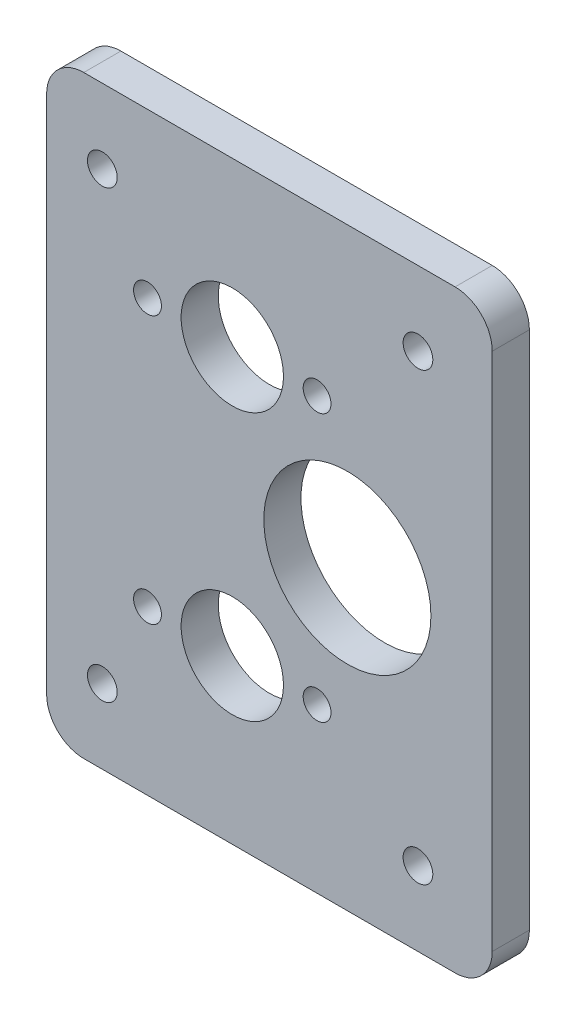
ISO-10303-21;
HEADER;
FILE_DESCRIPTION(('STEP AP214'),'2;1');
FILE_NAME('part.step','',(''),(''),'','','');
FILE_SCHEMA(('AUTOMOTIVE_DESIGN { 1 0 10303 214 1 1 1 1 }'));
ENDSEC;
DATA;
#1=APPLICATION_CONTEXT('core data for automotive mechanical design processes');
#2=APPLICATION_PROTOCOL_DEFINITION('international standard','automotive_design',2000,#1);
#3=PRODUCT_CONTEXT('',#1,'mechanical');
#4=PRODUCT('Part','Part','',(#3));
#5=PRODUCT_RELATED_PRODUCT_CATEGORY('part','',(#4));
#6=PRODUCT_DEFINITION_FORMATION('','',#4);
#7=PRODUCT_DEFINITION_CONTEXT('part definition',#1,'design');
#8=PRODUCT_DEFINITION('design','',#6,#7);
#9=PRODUCT_DEFINITION_SHAPE('','',#8);
#10=(LENGTH_UNIT() NAMED_UNIT(*) SI_UNIT(.MILLI.,.METRE.));
#11=(NAMED_UNIT(*) PLANE_ANGLE_UNIT() SI_UNIT($,.RADIAN.));
#12=(NAMED_UNIT(*) SI_UNIT($,.STERADIAN.) SOLID_ANGLE_UNIT());
#13=UNCERTAINTY_MEASURE_WITH_UNIT(LENGTH_MEASURE(1.E-05),#10,'distance_accuracy_value','');
#14=(GEOMETRIC_REPRESENTATION_CONTEXT(3) GLOBAL_UNCERTAINTY_ASSIGNED_CONTEXT((#13)) GLOBAL_UNIT_ASSIGNED_CONTEXT((#10,
#11,#12)) REPRESENTATION_CONTEXT('',''));
#15=CARTESIAN_POINT('',(0.,0.,0.));
#16=DIRECTION('',(0.,0.,1.));
#17=DIRECTION('',(1.,0.,0.));
#18=AXIS2_PLACEMENT_3D('',#15,#16,#17);
#19=CARTESIAN_POINT('',(0.,27.94,6.35));
#20=DIRECTION('',(0.,1.,0.));
#21=DIRECTION('',(0.,0.,1.));
#22=AXIS2_PLACEMENT_3D('',#19,#20,#21);
#23=PLANE('',#22);
#24=DIRECTION('',(1.,0.,0.));
#25=VECTOR('',#24,1.);
#26=CARTESIAN_POINT('',(0.,27.94,0.));
#27=LINE('',#26,#25);
#28=CARTESIAN_POINT('',(-25.4,27.94,0.));
#29=VERTEX_POINT('',#28);
#30=CARTESIAN_POINT('',(38.1,27.94,0.));
#31=VERTEX_POINT('',#30);
#32=EDGE_CURVE('E152',#29,#31,#27,.T.);
#33=ORIENTED_EDGE('',*,*,#32,.F.);
#34=DIRECTION('',(0.,0.,-1.));
#35=VECTOR('',#34,1.);
#36=CARTESIAN_POINT('',(-25.4,27.94,6.35));
#37=LINE('',#36,#35);
#38=CARTESIAN_POINT('',(-25.4,27.94,6.35));
#39=VERTEX_POINT('',#38);
#40=EDGE_CURVE('E11',#39,#29,#37,.T.);
#41=ORIENTED_EDGE('',*,*,#40,.F.);
#42=DIRECTION('',(1.,0.,0.));
#43=VECTOR('',#42,1.);
#44=CARTESIAN_POINT('',(0.,27.94,6.35));
#45=LINE('',#44,#43);
#46=CARTESIAN_POINT('',(38.1,27.94,6.35));
#47=VERTEX_POINT('',#46);
#48=EDGE_CURVE('E433',#39,#47,#45,.T.);
#49=ORIENTED_EDGE('',*,*,#48,.T.);
#50=DIRECTION('',(0.,0.,-1.));
#51=VECTOR('',#50,1.);
#52=CARTESIAN_POINT('',(38.1,27.94,6.35));
#53=LINE('',#52,#51);
#54=EDGE_CURVE('E53',#47,#31,#53,.T.);
#55=ORIENTED_EDGE('',*,*,#54,.T.);
#56=EDGE_LOOP('',(#33,#41,#49,#55));
#57=FACE_BOUND('',#56,.T.);
#58=ADVANCED_FACE('F36',(#57),#23,.T.);
#59=CARTESIAN_POINT('',(-25.4,21.59,6.35));
#60=DIRECTION('',(0.,0.,-1.));
#61=DIRECTION('',(-1.,0.,0.));
#62=AXIS2_PLACEMENT_3D('',#59,#60,#61);
#63=CYLINDRICAL_SURFACE('',#62,6.35);
#64=CARTESIAN_POINT('',(-25.4,21.59,0.));
#65=DIRECTION('',(0.,0.,1.));
#66=DIRECTION('',(1.,0.,0.));
#67=AXIS2_PLACEMENT_3D('',#64,#65,#66);
#68=CIRCLE('',#67,6.35);
#69=CARTESIAN_POINT('',(-31.75,21.59,0.));
#70=VERTEX_POINT('',#69);
#71=EDGE_CURVE('E154',#29,#70,#68,.T.);
#72=ORIENTED_EDGE('',*,*,#71,.T.);
#73=DIRECTION('',(0.,0.,-1.));
#74=VECTOR('',#73,1.);
#75=CARTESIAN_POINT('',(-31.75,21.59,6.35));
#76=LINE('',#75,#74);
#77=CARTESIAN_POINT('',(-31.75,21.59,6.35));
#78=VERTEX_POINT('',#77);
#79=EDGE_CURVE('E45',#78,#70,#76,.T.);
#80=ORIENTED_EDGE('',*,*,#79,.F.);
#81=CARTESIAN_POINT('',(-25.4,21.59,6.35));
#82=DIRECTION('',(0.,0.,1.));
#83=DIRECTION('',(1.,0.,0.));
#84=AXIS2_PLACEMENT_3D('',#81,#82,#83);
#85=CIRCLE('',#84,6.35);
#86=EDGE_CURVE('E435',#39,#78,#85,.T.);
#87=ORIENTED_EDGE('',*,*,#86,.F.);
#88=ORIENTED_EDGE('',*,*,#40,.T.);
#89=EDGE_LOOP('',(#72,#80,#87,#88));
#90=FACE_BOUND('',#89,.T.);
#91=ADVANCED_FACE('F191',(#90),#63,.T.);
#92=CARTESIAN_POINT('',(-31.75,0.,6.35));
#93=DIRECTION('',(1.,0.,0.));
#94=DIRECTION('',(0.,1.,0.));
#95=AXIS2_PLACEMENT_3D('',#92,#93,#94);
#96=PLANE('',#95);
#97=DIRECTION('',(0.,-1.,0.));
#98=VECTOR('',#97,1.);
#99=CARTESIAN_POINT('',(-31.75,0.,0.));
#100=LINE('',#99,#98);
#101=CARTESIAN_POINT('',(-31.75,-67.31,0.));
#102=VERTEX_POINT('',#101);
#103=EDGE_CURVE('E157',#70,#102,#100,.T.);
#104=ORIENTED_EDGE('',*,*,#103,.T.);
#105=DIRECTION('',(0.,0.,-1.));
#106=VECTOR('',#105,1.);
#107=CARTESIAN_POINT('',(-31.75,-67.31,6.35));
#108=LINE('',#107,#106);
#109=CARTESIAN_POINT('',(-31.75,-67.31,6.35));
#110=VERTEX_POINT('',#109);
#111=EDGE_CURVE('E179',#110,#102,#108,.T.);
#112=ORIENTED_EDGE('',*,*,#111,.F.);
#113=DIRECTION('',(0.,-1.,0.));
#114=VECTOR('',#113,1.);
#115=CARTESIAN_POINT('',(-31.75,0.,6.35));
#116=LINE('',#115,#114);
#117=EDGE_CURVE('E187',#78,#110,#116,.T.);
#118=ORIENTED_EDGE('',*,*,#117,.F.);
#119=ORIENTED_EDGE('',*,*,#79,.T.);
#120=EDGE_LOOP('',(#104,#112,#118,#119));
#121=FACE_BOUND('',#120,.T.);
#122=ADVANCED_FACE('F184',(#121),#96,.F.);
#123=CARTESIAN_POINT('',(-25.4,-67.31,6.35));
#124=DIRECTION('',(0.,0.,-1.));
#125=DIRECTION('',(-1.,0.,0.));
#126=AXIS2_PLACEMENT_3D('',#123,#124,#125);
#127=CYLINDRICAL_SURFACE('',#126,6.34999999999999);
#128=CARTESIAN_POINT('',(-25.4,-67.31,0.));
#129=DIRECTION('',(0.,0.,1.));
#130=DIRECTION('',(1.,0.,0.));
#131=AXIS2_PLACEMENT_3D('',#128,#129,#130);
#132=CIRCLE('',#131,6.34999999999999);
#133=CARTESIAN_POINT('',(-25.4,-73.66,0.));
#134=VERTEX_POINT('',#133);
#135=EDGE_CURVE('E160',#102,#134,#132,.T.);
#136=ORIENTED_EDGE('',*,*,#135,.T.);
#137=DIRECTION('',(0.,0.,-1.));
#138=VECTOR('',#137,1.);
#139=CARTESIAN_POINT('',(-25.4,-73.66,6.35));
#140=LINE('',#139,#138);
#141=CARTESIAN_POINT('',(-25.4,-73.66,6.35));
#142=VERTEX_POINT('',#141);
#143=EDGE_CURVE('E176',#142,#134,#140,.T.);
#144=ORIENTED_EDGE('',*,*,#143,.F.);
#145=CARTESIAN_POINT('',(-25.4,-67.31,6.35));
#146=DIRECTION('',(0.,0.,1.));
#147=DIRECTION('',(1.,0.,0.));
#148=AXIS2_PLACEMENT_3D('',#145,#146,#147);
#149=CIRCLE('',#148,6.34999999999999);
#150=EDGE_CURVE('E438',#110,#142,#149,.T.);
#151=ORIENTED_EDGE('',*,*,#150,.F.);
#152=ORIENTED_EDGE('',*,*,#111,.T.);
#153=EDGE_LOOP('',(#136,#144,#151,#152));
#154=FACE_BOUND('',#153,.T.);
#155=ADVANCED_FACE('F275',(#154),#127,.T.);
#156=CARTESIAN_POINT('',(0.,-73.66,6.35));
#157=DIRECTION('',(0.,1.,0.));
#158=DIRECTION('',(0.,0.,1.));
#159=AXIS2_PLACEMENT_3D('',#156,#157,#158);
#160=PLANE('',#159);
#161=DIRECTION('',(1.,0.,0.));
#162=VECTOR('',#161,1.);
#163=CARTESIAN_POINT('',(0.,-73.66,0.));
#164=LINE('',#163,#162);
#165=CARTESIAN_POINT('',(38.1,-73.66,0.));
#166=VERTEX_POINT('',#165);
#167=EDGE_CURVE('E163',#134,#166,#164,.T.);
#168=ORIENTED_EDGE('',*,*,#167,.T.);
#169=DIRECTION('',(0.,0.,-1.));
#170=VECTOR('',#169,1.);
#171=CARTESIAN_POINT('',(38.1,-73.66,6.35));
#172=LINE('',#171,#170);
#173=CARTESIAN_POINT('',(38.1,-73.66,6.35));
#174=VERTEX_POINT('',#173);
#175=EDGE_CURVE('E122',#174,#166,#172,.T.);
#176=ORIENTED_EDGE('',*,*,#175,.F.);
#177=DIRECTION('',(1.,0.,0.));
#178=VECTOR('',#177,1.);
#179=CARTESIAN_POINT('',(0.,-73.66,6.35));
#180=LINE('',#179,#178);
#181=EDGE_CURVE('E111',#142,#174,#180,.T.);
#182=ORIENTED_EDGE('',*,*,#181,.F.);
#183=ORIENTED_EDGE('',*,*,#143,.T.);
#184=EDGE_LOOP('',(#168,#176,#182,#183));
#185=FACE_BOUND('',#184,.T.);
#186=ADVANCED_FACE('F272',(#185),#160,.F.);
#187=CARTESIAN_POINT('',(38.1,-67.31,6.35));
#188=DIRECTION('',(0.,0.,-1.));
#189=DIRECTION('',(-1.,0.,0.));
#190=AXIS2_PLACEMENT_3D('',#187,#188,#189);
#191=CYLINDRICAL_SURFACE('',#190,6.35);
#192=CARTESIAN_POINT('',(38.1,-67.31,0.));
#193=DIRECTION('',(0.,0.,1.));
#194=DIRECTION('',(1.,0.,0.));
#195=AXIS2_PLACEMENT_3D('',#192,#193,#194);
#196=CIRCLE('',#195,6.35);
#197=CARTESIAN_POINT('',(44.45,-67.31,0.));
#198=VERTEX_POINT('',#197);
#199=EDGE_CURVE('E119',#166,#198,#196,.T.);
#200=ORIENTED_EDGE('',*,*,#199,.T.);
#201=DIRECTION('',(0.,0.,-1.));
#202=VECTOR('',#201,1.);
#203=CARTESIAN_POINT('',(44.45,-67.31,6.35));
#204=LINE('',#203,#202);
#205=CARTESIAN_POINT('',(44.45,-67.31,6.35));
#206=VERTEX_POINT('',#205);
#207=EDGE_CURVE('E117',#206,#198,#204,.T.);
#208=ORIENTED_EDGE('',*,*,#207,.F.);
#209=CARTESIAN_POINT('',(38.1,-67.31,6.35));
#210=DIRECTION('',(0.,0.,1.));
#211=DIRECTION('',(1.,0.,0.));
#212=AXIS2_PLACEMENT_3D('',#209,#210,#211);
#213=CIRCLE('',#212,6.35);
#214=EDGE_CURVE('E103',#174,#206,#213,.T.);
#215=ORIENTED_EDGE('',*,*,#214,.F.);
#216=ORIENTED_EDGE('',*,*,#175,.T.);
#217=EDGE_LOOP('',(#200,#208,#215,#216));
#218=FACE_BOUND('',#217,.T.);
#219=ADVANCED_FACE('F118',(#218),#191,.T.);
#220=CARTESIAN_POINT('',(44.45,0.,6.35));
#221=DIRECTION('',(1.,0.,0.));
#222=DIRECTION('',(0.,1.,0.));
#223=AXIS2_PLACEMENT_3D('',#220,#221,#222);
#224=PLANE('',#223);
#225=DIRECTION('',(0.,-1.,0.));
#226=VECTOR('',#225,1.);
#227=CARTESIAN_POINT('',(44.45,0.,0.));
#228=LINE('',#227,#226);
#229=CARTESIAN_POINT('',(44.45,21.59,0.));
#230=VERTEX_POINT('',#229);
#231=EDGE_CURVE('E167',#230,#198,#228,.T.);
#232=ORIENTED_EDGE('',*,*,#231,.F.);
#233=DIRECTION('',(0.,0.,-1.));
#234=VECTOR('',#233,1.);
#235=CARTESIAN_POINT('',(44.45,21.59,6.35));
#236=LINE('',#235,#234);
#237=CARTESIAN_POINT('',(44.45,21.59,6.35));
#238=VERTEX_POINT('',#237);
#239=EDGE_CURVE('E78',#238,#230,#236,.T.);
#240=ORIENTED_EDGE('',*,*,#239,.F.);
#241=DIRECTION('',(0.,-1.,0.));
#242=VECTOR('',#241,1.);
#243=CARTESIAN_POINT('',(44.45,0.,6.35));
#244=LINE('',#243,#242);
#245=EDGE_CURVE('E109',#238,#206,#244,.T.);
#246=ORIENTED_EDGE('',*,*,#245,.T.);
#247=ORIENTED_EDGE('',*,*,#207,.T.);
#248=EDGE_LOOP('',(#232,#240,#246,#247));
#249=FACE_BOUND('',#248,.T.);
#250=ADVANCED_FACE('F124',(#249),#224,.T.);
#251=CARTESIAN_POINT('',(14.5,0.,6.35));
#252=DIRECTION('',(0.,0.,-1.));
#253=DIRECTION('',(-1.,0.,0.));
#254=AXIS2_PLACEMENT_3D('',#251,#252,#253);
#255=CYLINDRICAL_SURFACE('',#254,2.38125);
#256=CARTESIAN_POINT('',(14.5,0.,6.35));
#257=DIRECTION('',(0.,0.,1.));
#258=DIRECTION('',(1.,0.,0.));
#259=AXIS2_PLACEMENT_3D('',#256,#257,#258);
#260=CIRCLE('',#259,2.38125);
#261=CARTESIAN_POINT('',(16.88125,0.,6.35));
#262=VERTEX_POINT('',#261);
#263=EDGE_CURVE('E430',#262,#262,#260,.T.);
#264=ORIENTED_EDGE('',*,*,#263,.T.);
#265=EDGE_LOOP('',(#264));
#266=FACE_BOUND('',#265,.T.);
#267=CARTESIAN_POINT('',(14.5,0.,0.));
#268=DIRECTION('',(0.,0.,1.));
#269=DIRECTION('',(1.,0.,0.));
#270=AXIS2_PLACEMENT_3D('',#267,#268,#269);
#271=CIRCLE('',#270,2.38125);
#272=CARTESIAN_POINT('',(16.88125,0.,0.));
#273=VERTEX_POINT('',#272);
#274=EDGE_CURVE('E149',#273,#273,#271,.T.);
#275=ORIENTED_EDGE('',*,*,#274,.F.);
#276=EDGE_LOOP('',(#275));
#277=FACE_BOUND('',#276,.T.);
#278=ADVANCED_FACE('F202',(#266,#277),#255,.F.);
#279=CARTESIAN_POINT('',(-14.5,0.,6.35));
#280=DIRECTION('',(0.,0.,-1.));
#281=DIRECTION('',(-1.,0.,0.));
#282=AXIS2_PLACEMENT_3D('',#279,#280,#281);
#283=CYLINDRICAL_SURFACE('',#282,2.38125);
#284=CARTESIAN_POINT('',(-14.5,0.,6.35));
#285=DIRECTION('',(0.,0.,1.));
#286=DIRECTION('',(1.,0.,0.));
#287=AXIS2_PLACEMENT_3D('',#284,#285,#286);
#288=CIRCLE('',#287,2.38125);
#289=CARTESIAN_POINT('',(-12.11875,0.,6.35));
#290=VERTEX_POINT('',#289);
#291=EDGE_CURVE('E427',#290,#290,#288,.T.);
#292=ORIENTED_EDGE('',*,*,#291,.T.);
#293=EDGE_LOOP('',(#292));
#294=FACE_BOUND('',#293,.T.);
#295=CARTESIAN_POINT('',(-14.5,0.,0.));
#296=DIRECTION('',(0.,0.,1.));
#297=DIRECTION('',(1.,0.,0.));
#298=AXIS2_PLACEMENT_3D('',#295,#296,#297);
#299=CIRCLE('',#298,2.38125);
#300=CARTESIAN_POINT('',(-12.11875,0.,0.));
#301=VERTEX_POINT('',#300);
#302=EDGE_CURVE('E146',#301,#301,#299,.T.);
#303=ORIENTED_EDGE('',*,*,#302,.F.);
#304=EDGE_LOOP('',(#303));
#305=FACE_BOUND('',#304,.T.);
#306=ADVANCED_FACE('F205',(#294,#305),#283,.F.);
#307=CARTESIAN_POINT('',(0.,0.,6.35));
#308=DIRECTION('',(0.,0.,-1.));
#309=DIRECTION('',(-1.,0.,0.));
#310=AXIS2_PLACEMENT_3D('',#307,#308,#309);
#311=CYLINDRICAL_SURFACE('',#310,8.75);
#312=CARTESIAN_POINT('',(0.,0.,6.35));
#313=DIRECTION('',(0.,0.,1.));
#314=DIRECTION('',(1.,0.,0.));
#315=AXIS2_PLACEMENT_3D('',#312,#313,#314);
#316=CIRCLE('',#315,8.75);
#317=CARTESIAN_POINT('',(8.75,0.,6.35));
#318=VERTEX_POINT('',#317);
#319=EDGE_CURVE('E424',#318,#318,#316,.T.);
#320=ORIENTED_EDGE('',*,*,#319,.T.);
#321=EDGE_LOOP('',(#320));
#322=FACE_BOUND('',#321,.T.);
#323=CARTESIAN_POINT('',(0.,0.,0.));
#324=DIRECTION('',(0.,0.,1.));
#325=DIRECTION('',(1.,0.,0.));
#326=AXIS2_PLACEMENT_3D('',#323,#324,#325);
#327=CIRCLE('',#326,8.75);
#328=CARTESIAN_POINT('',(8.75,0.,0.));
#329=VERTEX_POINT('',#328);
#330=EDGE_CURVE('E143',#329,#329,#327,.T.);
#331=ORIENTED_EDGE('',*,*,#330,.F.);
#332=EDGE_LOOP('',(#331));
#333=FACE_BOUND('',#332,.T.);
#334=ADVANCED_FACE('F209',(#322,#333),#311,.F.);
#335=CARTESIAN_POINT('',(-14.5,-45.72,6.35));
#336=DIRECTION('',(0.,0.,-1.));
#337=DIRECTION('',(-1.,0.,0.));
#338=AXIS2_PLACEMENT_3D('',#335,#336,#337);
#339=CYLINDRICAL_SURFACE('',#338,2.38125);
#340=CARTESIAN_POINT('',(-14.5,-45.72,6.35));
#341=DIRECTION('',(0.,0.,1.));
#342=DIRECTION('',(1.,0.,0.));
#343=AXIS2_PLACEMENT_3D('',#340,#341,#342);
#344=CIRCLE('',#343,2.38125);
#345=CARTESIAN_POINT('',(-12.11875,-45.72,6.35));
#346=VERTEX_POINT('',#345);
#347=EDGE_CURVE('E421',#346,#346,#344,.T.);
#348=ORIENTED_EDGE('',*,*,#347,.T.);
#349=EDGE_LOOP('',(#348));
#350=FACE_BOUND('',#349,.T.);
#351=CARTESIAN_POINT('',(-14.5,-45.72,0.));
#352=DIRECTION('',(0.,0.,1.));
#353=DIRECTION('',(1.,0.,0.));
#354=AXIS2_PLACEMENT_3D('',#351,#352,#353);
#355=CIRCLE('',#354,2.38125);
#356=CARTESIAN_POINT('',(-12.11875,-45.72,0.));
#357=VERTEX_POINT('',#356);
#358=EDGE_CURVE('E140',#357,#357,#355,.T.);
#359=ORIENTED_EDGE('',*,*,#358,.F.);
#360=EDGE_LOOP('',(#359));
#361=FACE_BOUND('',#360,.T.);
#362=ADVANCED_FACE('F213',(#350,#361),#339,.F.);
#363=CARTESIAN_POINT('',(14.5,-45.72,6.35));
#364=DIRECTION('',(0.,0.,-1.));
#365=DIRECTION('',(-1.,0.,0.));
#366=AXIS2_PLACEMENT_3D('',#363,#364,#365);
#367=CYLINDRICAL_SURFACE('',#366,2.38125);
#368=CARTESIAN_POINT('',(14.5,-45.72,6.35));
#369=DIRECTION('',(0.,0.,1.));
#370=DIRECTION('',(1.,0.,0.));
#371=AXIS2_PLACEMENT_3D('',#368,#369,#370);
#372=CIRCLE('',#371,2.38125);
#373=CARTESIAN_POINT('',(16.88125,-45.72,6.35));
#374=VERTEX_POINT('',#373);
#375=EDGE_CURVE('E418',#374,#374,#372,.T.);
#376=ORIENTED_EDGE('',*,*,#375,.T.);
#377=EDGE_LOOP('',(#376));
#378=FACE_BOUND('',#377,.T.);
#379=CARTESIAN_POINT('',(14.5,-45.72,0.));
#380=DIRECTION('',(0.,0.,1.));
#381=DIRECTION('',(1.,0.,0.));
#382=AXIS2_PLACEMENT_3D('',#379,#380,#381);
#383=CIRCLE('',#382,2.38125);
#384=CARTESIAN_POINT('',(16.88125,-45.72,0.));
#385=VERTEX_POINT('',#384);
#386=EDGE_CURVE('E137',#385,#385,#383,.T.);
#387=ORIENTED_EDGE('',*,*,#386,.F.);
#388=EDGE_LOOP('',(#387));
#389=FACE_BOUND('',#388,.T.);
#390=ADVANCED_FACE('F217',(#378,#389),#367,.F.);
#391=CARTESIAN_POINT('',(19.6773170490796,-22.86,6.35));
#392=DIRECTION('',(0.,0.,-1.));
#393=DIRECTION('',(-1.,0.,0.));
#394=AXIS2_PLACEMENT_3D('',#391,#392,#393);
#395=CYLINDRICAL_SURFACE('',#394,14.2875);
#396=CARTESIAN_POINT('',(19.6773170490796,-22.86,6.35));
#397=DIRECTION('',(0.,0.,1.));
#398=DIRECTION('',(1.,0.,0.));
#399=AXIS2_PLACEMENT_3D('',#396,#397,#398);
#400=CIRCLE('',#399,14.2875);
#401=CARTESIAN_POINT('',(33.9648170490796,-22.86,6.35));
#402=VERTEX_POINT('',#401);
#403=EDGE_CURVE('E232',#402,#402,#400,.T.);
#404=ORIENTED_EDGE('',*,*,#403,.T.);
#405=EDGE_LOOP('',(#404));
#406=FACE_BOUND('',#405,.T.);
#407=CARTESIAN_POINT('',(19.6773170490796,-22.86,0.));
#408=DIRECTION('',(0.,0.,1.));
#409=DIRECTION('',(1.,0.,0.));
#410=AXIS2_PLACEMENT_3D('',#407,#408,#409);
#411=CIRCLE('',#410,14.2875);
#412=CARTESIAN_POINT('',(33.9648170490796,-22.86,0.));
#413=VERTEX_POINT('',#412);
#414=EDGE_CURVE('E133',#413,#413,#411,.T.);
#415=ORIENTED_EDGE('',*,*,#414,.F.);
#416=EDGE_LOOP('',(#415));
#417=FACE_BOUND('',#416,.T.);
#418=ADVANCED_FACE('F220',(#406,#417),#395,.F.);
#419=CARTESIAN_POINT('',(0.,-45.72,6.35));
#420=DIRECTION('',(0.,0.,-1.));
#421=DIRECTION('',(-1.,0.,0.));
#422=AXIS2_PLACEMENT_3D('',#419,#420,#421);
#423=CYLINDRICAL_SURFACE('',#422,8.75);
#424=CARTESIAN_POINT('',(0.,-45.72,6.35));
#425=DIRECTION('',(0.,0.,1.));
#426=DIRECTION('',(1.,0.,0.));
#427=AXIS2_PLACEMENT_3D('',#424,#425,#426);
#428=CIRCLE('',#427,8.75);
#429=CARTESIAN_POINT('',(8.75,-45.72,6.35));
#430=VERTEX_POINT('',#429);
#431=EDGE_CURVE('E172',#430,#430,#428,.T.);
#432=ORIENTED_EDGE('',*,*,#431,.T.);
#433=EDGE_LOOP('',(#432));
#434=FACE_BOUND('',#433,.T.);
#435=CARTESIAN_POINT('',(0.,-45.72,0.));
#436=DIRECTION('',(0.,0.,1.));
#437=DIRECTION('',(1.,0.,0.));
#438=AXIS2_PLACEMENT_3D('',#435,#436,#437);
#439=CIRCLE('',#438,8.75);
#440=CARTESIAN_POINT('',(8.75,-45.72,0.));
#441=VERTEX_POINT('',#440);
#442=EDGE_CURVE('E130',#441,#441,#439,.T.);
#443=ORIENTED_EDGE('',*,*,#442,.F.);
#444=EDGE_LOOP('',(#443));
#445=FACE_BOUND('',#444,.T.);
#446=ADVANCED_FACE('F38',(#434,#445),#423,.F.);
#447=CARTESIAN_POINT('',(38.1,21.59,6.35));
#448=DIRECTION('',(0.,0.,-1.));
#449=DIRECTION('',(-1.,0.,0.));
#450=AXIS2_PLACEMENT_3D('',#447,#448,#449);
#451=CYLINDRICAL_SURFACE('',#450,6.35);
#452=CARTESIAN_POINT('',(38.1,21.59,0.));
#453=DIRECTION('',(0.,0.,1.));
#454=DIRECTION('',(1.,0.,0.));
#455=AXIS2_PLACEMENT_3D('',#452,#453,#454);
#456=CIRCLE('',#455,6.35);
#457=EDGE_CURVE('E169',#31,#230,#456,.F.);
#458=ORIENTED_EDGE('',*,*,#457,.F.);
#459=ORIENTED_EDGE('',*,*,#54,.F.);
#460=CARTESIAN_POINT('',(38.1,21.59,6.35));
#461=DIRECTION('',(0.,0.,1.));
#462=DIRECTION('',(1.,0.,0.));
#463=AXIS2_PLACEMENT_3D('',#460,#461,#462);
#464=CIRCLE('',#463,6.35);
#465=EDGE_CURVE('E125',#47,#238,#464,.F.);
#466=ORIENTED_EDGE('',*,*,#465,.T.);
#467=ORIENTED_EDGE('',*,*,#239,.T.);
#468=EDGE_LOOP('',(#458,#459,#466,#467));
#469=FACE_BOUND('',#468,.T.);
#470=ADVANCED_FACE('F227',(#469),#451,.T.);
#471=CARTESIAN_POINT('',(0.,0.,6.35));
#472=DIRECTION('',(0.,0.,1.));
#473=DIRECTION('',(1.,0.,0.));
#474=AXIS2_PLACEMENT_3D('',#471,#472,#473);
#475=PLANE('',#474);
#476=CARTESIAN_POINT('',(31.75,15.24,6.35));
#477=DIRECTION('',(0.,0.,1.));
#478=DIRECTION('',(1.,0.,0.));
#479=AXIS2_PLACEMENT_3D('',#476,#477,#478);
#480=CIRCLE('',#479,2.54);
#481=CARTESIAN_POINT('',(34.29,15.24,6.35));
#482=VERTEX_POINT('',#481);
#483=EDGE_CURVE('E394',#482,#482,#480,.T.);
#484=ORIENTED_EDGE('',*,*,#483,.F.);
#485=EDGE_LOOP('',(#484));
#486=FACE_BOUND('',#485,.T.);
#487=CARTESIAN_POINT('',(31.75,-60.96,6.35));
#488=DIRECTION('',(0.,0.,1.));
#489=DIRECTION('',(1.,0.,0.));
#490=AXIS2_PLACEMENT_3D('',#487,#488,#489);
#491=CIRCLE('',#490,2.54);
#492=CARTESIAN_POINT('',(34.29,-60.96,6.35));
#493=VERTEX_POINT('',#492);
#494=EDGE_CURVE('E399',#493,#493,#491,.T.);
#495=ORIENTED_EDGE('',*,*,#494,.F.);
#496=EDGE_LOOP('',(#495));
#497=FACE_BOUND('',#496,.T.);
#498=CARTESIAN_POINT('',(-22.225,-60.96,6.35));
#499=DIRECTION('',(0.,0.,1.));
#500=DIRECTION('',(1.,0.,0.));
#501=AXIS2_PLACEMENT_3D('',#498,#499,#500);
#502=CIRCLE('',#501,2.54);
#503=CARTESIAN_POINT('',(-19.685,-60.96,6.35));
#504=VERTEX_POINT('',#503);
#505=EDGE_CURVE('E405',#504,#504,#502,.T.);
#506=ORIENTED_EDGE('',*,*,#505,.F.);
#507=EDGE_LOOP('',(#506));
#508=FACE_BOUND('',#507,.T.);
#509=CARTESIAN_POINT('',(-22.225,15.24,6.35));
#510=DIRECTION('',(0.,0.,1.));
#511=DIRECTION('',(1.,0.,0.));
#512=AXIS2_PLACEMENT_3D('',#509,#510,#511);
#513=CIRCLE('',#512,2.54);
#514=CARTESIAN_POINT('',(-19.685,15.24,6.35));
#515=VERTEX_POINT('',#514);
#516=EDGE_CURVE('E395',#515,#515,#513,.T.);
#517=ORIENTED_EDGE('',*,*,#516,.F.);
#518=EDGE_LOOP('',(#517));
#519=FACE_BOUND('',#518,.T.);
#520=ORIENTED_EDGE('',*,*,#431,.F.);
#521=EDGE_LOOP('',(#520));
#522=FACE_BOUND('',#521,.T.);
#523=ORIENTED_EDGE('',*,*,#403,.F.);
#524=EDGE_LOOP('',(#523));
#525=FACE_BOUND('',#524,.T.);
#526=ORIENTED_EDGE('',*,*,#375,.F.);
#527=EDGE_LOOP('',(#526));
#528=FACE_BOUND('',#527,.T.);
#529=ORIENTED_EDGE('',*,*,#347,.F.);
#530=EDGE_LOOP('',(#529));
#531=FACE_BOUND('',#530,.T.);
#532=ORIENTED_EDGE('',*,*,#319,.F.);
#533=EDGE_LOOP('',(#532));
#534=FACE_BOUND('',#533,.T.);
#535=ORIENTED_EDGE('',*,*,#291,.F.);
#536=EDGE_LOOP('',(#535));
#537=FACE_BOUND('',#536,.T.);
#538=ORIENTED_EDGE('',*,*,#263,.F.);
#539=EDGE_LOOP('',(#538));
#540=FACE_BOUND('',#539,.T.);
#541=ORIENTED_EDGE('',*,*,#48,.F.);
#542=ORIENTED_EDGE('',*,*,#86,.T.);
#543=ORIENTED_EDGE('',*,*,#117,.T.);
#544=ORIENTED_EDGE('',*,*,#150,.T.);
#545=ORIENTED_EDGE('',*,*,#181,.T.);
#546=ORIENTED_EDGE('',*,*,#214,.T.);
#547=ORIENTED_EDGE('',*,*,#245,.F.);
#548=ORIENTED_EDGE('',*,*,#465,.F.);
#549=EDGE_LOOP('',(#541,#542,#543,#544,#545,#546,#547,#548));
#550=FACE_BOUND('',#549,.T.);
#551=ADVANCED_FACE('F106',(#486,#497,#508,#519,#522,#525,#528,#531,#534,#537,#540,#550),#475,.T.);
#552=CARTESIAN_POINT('',(0.,0.,0.));
#553=DIRECTION('',(0.,0.,1.));
#554=DIRECTION('',(1.,0.,0.));
#555=AXIS2_PLACEMENT_3D('',#552,#553,#554);
#556=PLANE('',#555);
#557=CARTESIAN_POINT('',(31.75,15.24,0.));
#558=DIRECTION('',(0.,0.,1.));
#559=DIRECTION('',(1.,0.,0.));
#560=AXIS2_PLACEMENT_3D('',#557,#558,#559);
#561=CIRCLE('',#560,2.54);
#562=CARTESIAN_POINT('',(34.29,15.24,0.));
#563=VERTEX_POINT('',#562);
#564=EDGE_CURVE('E391',#563,#563,#561,.F.);
#565=ORIENTED_EDGE('',*,*,#564,.F.);
#566=EDGE_LOOP('',(#565));
#567=FACE_BOUND('',#566,.T.);
#568=CARTESIAN_POINT('',(31.75,-60.96,0.));
#569=DIRECTION('',(0.,0.,1.));
#570=DIRECTION('',(1.,0.,0.));
#571=AXIS2_PLACEMENT_3D('',#568,#569,#570);
#572=CIRCLE('',#571,2.54);
#573=CARTESIAN_POINT('',(34.29,-60.96,0.));
#574=VERTEX_POINT('',#573);
#575=EDGE_CURVE('E402',#574,#574,#572,.F.);
#576=ORIENTED_EDGE('',*,*,#575,.F.);
#577=EDGE_LOOP('',(#576));
#578=FACE_BOUND('',#577,.T.);
#579=CARTESIAN_POINT('',(-22.225,-60.96,0.));
#580=DIRECTION('',(0.,0.,1.));
#581=DIRECTION('',(1.,0.,0.));
#582=AXIS2_PLACEMENT_3D('',#579,#580,#581);
#583=CIRCLE('',#582,2.54);
#584=CARTESIAN_POINT('',(-19.685,-60.96,0.));
#585=VERTEX_POINT('',#584);
#586=EDGE_CURVE('E408',#585,#585,#583,.F.);
#587=ORIENTED_EDGE('',*,*,#586,.F.);
#588=EDGE_LOOP('',(#587));
#589=FACE_BOUND('',#588,.T.);
#590=CARTESIAN_POINT('',(-22.225,15.24,0.));
#591=DIRECTION('',(0.,0.,1.));
#592=DIRECTION('',(1.,0.,0.));
#593=AXIS2_PLACEMENT_3D('',#590,#591,#592);
#594=CIRCLE('',#593,2.54);
#595=CARTESIAN_POINT('',(-19.685,15.24,0.));
#596=VERTEX_POINT('',#595);
#597=EDGE_CURVE('E134',#596,#596,#594,.F.);
#598=ORIENTED_EDGE('',*,*,#597,.F.);
#599=EDGE_LOOP('',(#598));
#600=FACE_BOUND('',#599,.T.);
#601=ORIENTED_EDGE('',*,*,#442,.T.);
#602=EDGE_LOOP('',(#601));
#603=FACE_BOUND('',#602,.T.);
#604=ORIENTED_EDGE('',*,*,#414,.T.);
#605=EDGE_LOOP('',(#604));
#606=FACE_BOUND('',#605,.T.);
#607=ORIENTED_EDGE('',*,*,#386,.T.);
#608=EDGE_LOOP('',(#607));
#609=FACE_BOUND('',#608,.T.);
#610=ORIENTED_EDGE('',*,*,#358,.T.);
#611=EDGE_LOOP('',(#610));
#612=FACE_BOUND('',#611,.T.);
#613=ORIENTED_EDGE('',*,*,#330,.T.);
#614=EDGE_LOOP('',(#613));
#615=FACE_BOUND('',#614,.T.);
#616=ORIENTED_EDGE('',*,*,#302,.T.);
#617=EDGE_LOOP('',(#616));
#618=FACE_BOUND('',#617,.T.);
#619=ORIENTED_EDGE('',*,*,#274,.T.);
#620=EDGE_LOOP('',(#619));
#621=FACE_BOUND('',#620,.T.);
#622=ORIENTED_EDGE('',*,*,#32,.T.);
#623=ORIENTED_EDGE('',*,*,#457,.T.);
#624=ORIENTED_EDGE('',*,*,#231,.T.);
#625=ORIENTED_EDGE('',*,*,#199,.F.);
#626=ORIENTED_EDGE('',*,*,#167,.F.);
#627=ORIENTED_EDGE('',*,*,#135,.F.);
#628=ORIENTED_EDGE('',*,*,#103,.F.);
#629=ORIENTED_EDGE('',*,*,#71,.F.);
#630=EDGE_LOOP('',(#622,#623,#624,#625,#626,#627,#628,#629));
#631=FACE_BOUND('',#630,.T.);
#632=ADVANCED_FACE('F193',(#567,#578,#589,#600,#603,#606,#609,#612,#615,#618,#621,#631),#556,.F.);
#633=CARTESIAN_POINT('',(-22.225,15.24,-7.18420489685533));
#634=DIRECTION('',(0.,0.,1.));
#635=DIRECTION('',(1.,0.,0.));
#636=AXIS2_PLACEMENT_3D('',#633,#634,#635);
#637=CYLINDRICAL_SURFACE('',#636,2.54);
#638=CARTESIAN_POINT('',(-19.685,15.24,0.));
#639=CARTESIAN_POINT('',(-19.685,15.24,0.0661458333333324));
#640=CARTESIAN_POINT('',(-19.685,15.24,0.132291666666666));
#641=CARTESIAN_POINT('',(-19.685,15.24,0.264583333333332));
#642=CARTESIAN_POINT('',(-19.685,15.24,0.330729166666666));
#643=CARTESIAN_POINT('',(-19.685,15.24,0.463020833333332));
#644=CARTESIAN_POINT('',(-19.685,15.24,0.529166666666666));
#645=CARTESIAN_POINT('',(-19.685,15.24,0.661458333333332));
#646=CARTESIAN_POINT('',(-19.685,15.24,0.727604166666665));
#647=CARTESIAN_POINT('',(-19.685,15.24,0.859895833333331));
#648=CARTESIAN_POINT('',(-19.685,15.24,0.926041666666665));
#649=CARTESIAN_POINT('',(-19.685,15.24,1.05833333333333));
#650=CARTESIAN_POINT('',(-19.685,15.24,1.12447916666667));
#651=CARTESIAN_POINT('',(-19.685,15.24,1.25677083333333));
#652=CARTESIAN_POINT('',(-19.685,15.24,1.32291666666666));
#653=CARTESIAN_POINT('',(-19.685,15.24,1.45520833333333));
#654=CARTESIAN_POINT('',(-19.685,15.24,1.52135416666667));
#655=CARTESIAN_POINT('',(-19.685,15.24,1.65364583333333));
#656=CARTESIAN_POINT('',(-19.685,15.24,1.71979166666667));
#657=CARTESIAN_POINT('',(-19.685,15.24,1.85208333333333));
#658=CARTESIAN_POINT('',(-19.685,15.24,1.91822916666667));
#659=CARTESIAN_POINT('',(-19.685,15.24,2.05052083333333));
#660=CARTESIAN_POINT('',(-19.685,15.24,2.11666666666667));
#661=CARTESIAN_POINT('',(-19.685,15.24,2.24895833333333));
#662=CARTESIAN_POINT('',(-19.685,15.24,2.31510416666667));
#663=CARTESIAN_POINT('',(-19.685,15.24,2.44739583333333));
#664=CARTESIAN_POINT('',(-19.685,15.24,2.51354166666667));
#665=CARTESIAN_POINT('',(-19.685,15.24,2.64583333333333));
#666=CARTESIAN_POINT('',(-19.685,15.24,2.71197916666667));
#667=CARTESIAN_POINT('',(-19.685,15.24,2.84427083333333));
#668=CARTESIAN_POINT('',(-19.685,15.24,2.91041666666667));
#669=CARTESIAN_POINT('',(-19.685,15.24,3.04270833333333));
#670=CARTESIAN_POINT('',(-19.685,15.24,3.10885416666667));
#671=CARTESIAN_POINT('',(-19.685,15.24,3.24114583333333));
#672=CARTESIAN_POINT('',(-19.685,15.24,3.30729166666667));
#673=CARTESIAN_POINT('',(-19.685,15.24,3.43958333333333));
#674=CARTESIAN_POINT('',(-19.685,15.24,3.50572916666667));
#675=CARTESIAN_POINT('',(-19.685,15.24,3.63802083333333));
#676=CARTESIAN_POINT('',(-19.685,15.24,3.70416666666667));
#677=CARTESIAN_POINT('',(-19.685,15.24,3.83645833333333));
#678=CARTESIAN_POINT('',(-19.685,15.24,3.90260416666667));
#679=CARTESIAN_POINT('',(-19.685,15.24,4.03489583333333));
#680=CARTESIAN_POINT('',(-19.685,15.24,4.10104166666667));
#681=CARTESIAN_POINT('',(-19.685,15.24,4.23333333333333));
#682=CARTESIAN_POINT('',(-19.685,15.24,4.29947916666667));
#683=CARTESIAN_POINT('',(-19.685,15.24,4.43177083333333));
#684=CARTESIAN_POINT('',(-19.685,15.24,4.49791666666667));
#685=CARTESIAN_POINT('',(-19.685,15.24,4.63020833333333));
#686=CARTESIAN_POINT('',(-19.685,15.24,4.69635416666667));
#687=CARTESIAN_POINT('',(-19.685,15.24,4.82864583333333));
#688=CARTESIAN_POINT('',(-19.685,15.24,4.89479166666667));
#689=CARTESIAN_POINT('',(-19.685,15.24,5.02708333333333));
#690=CARTESIAN_POINT('',(-19.685,15.24,5.09322916666667));
#691=CARTESIAN_POINT('',(-19.685,15.24,5.22552083333333));
#692=CARTESIAN_POINT('',(-19.685,15.24,5.29166666666667));
#693=CARTESIAN_POINT('',(-19.685,15.24,5.42395833333333));
#694=CARTESIAN_POINT('',(-19.685,15.24,5.49010416666667));
#695=CARTESIAN_POINT('',(-19.685,15.24,5.62239583333333));
#696=CARTESIAN_POINT('',(-19.685,15.24,5.68854166666667));
#697=CARTESIAN_POINT('',(-19.685,15.24,5.82083333333333));
#698=CARTESIAN_POINT('',(-19.685,15.24,5.88697916666667));
#699=CARTESIAN_POINT('',(-19.685,15.24,6.01927083333333));
#700=CARTESIAN_POINT('',(-19.685,15.24,6.08541666666667));
#701=CARTESIAN_POINT('',(-19.685,15.24,6.21770833333333));
#702=CARTESIAN_POINT('',(-19.685,15.24,6.28385416666667));
#703=CARTESIAN_POINT('',(-19.685,15.24,6.35));
#704=B_SPLINE_CURVE_WITH_KNOTS('',3,(#638,#639,#640,#641,#642,#643,#644,#645,#646,#647,#648,
#649,#650,#651,#652,#653,#654,#655,#656,#657,#658,#659,#660,#661,#662,#663,#664,#665,#666,#667,
#668,#669,#670,#671,#672,#673,#674,#675,#676,#677,#678,#679,#680,#681,#682,#683,#684,#685,#686,
#687,#688,#689,#690,#691,#692,#693,#694,#695,#696,#697,#698,#699,#700,#701,#702,#703),
.UNSPECIFIED.,.F.,.F.,(4,2,2,2,2,2,2,2,2,2,2,2,2,2,2,2,2,2,2,2,2,2,2,2,2,2,2,2,2,2,2,2,4),(0.,
0.1984375,0.396875,0.5953125,0.793749999999998,0.992187499999999,1.190625,1.3890625,1.5875,
1.7859375,1.984375,2.1828125,2.38125,2.5796875,2.778125,2.9765625,3.175,3.3734375,3.571875,
3.7703125,3.96875,4.1671875,4.365625,4.5640625,4.7625,4.9609375,5.159375,5.3578125,5.55625,
5.7546875,5.953125,6.1515625,6.35),.UNSPECIFIED.);
#705=EDGE_CURVE('BSEAM237',#596,#515,#704,.T.);
#706=ORIENTED_EDGE('',*,*,#597,.T.);
#707=ORIENTED_EDGE('',*,*,#516,.T.);
#708=ORIENTED_EDGE('',*,*,#705,.T.);
#709=ORIENTED_EDGE('',*,*,#705,.F.);
#710=EDGE_LOOP('',(#706,#708,#707,#709));
#711=FACE_BOUND('',#710,.T.);
#712=ADVANCED_FACE('F237',(#711),#637,.F.);
#713=CARTESIAN_POINT('',(-22.225,-60.96,-7.18420489685533));
#714=DIRECTION('',(0.,0.,1.));
#715=DIRECTION('',(1.,0.,0.));
#716=AXIS2_PLACEMENT_3D('',#713,#714,#715);
#717=CYLINDRICAL_SURFACE('',#716,2.54);
#718=CARTESIAN_POINT('',(-19.685,-60.96,0.));
#719=CARTESIAN_POINT('',(-19.685,-60.96,0.0661458333333324));
#720=CARTESIAN_POINT('',(-19.685,-60.96,0.132291666666666));
#721=CARTESIAN_POINT('',(-19.685,-60.96,0.264583333333332));
#722=CARTESIAN_POINT('',(-19.685,-60.96,0.330729166666666));
#723=CARTESIAN_POINT('',(-19.685,-60.96,0.463020833333332));
#724=CARTESIAN_POINT('',(-19.685,-60.96,0.529166666666666));
#725=CARTESIAN_POINT('',(-19.685,-60.96,0.661458333333332));
#726=CARTESIAN_POINT('',(-19.685,-60.96,0.727604166666665));
#727=CARTESIAN_POINT('',(-19.685,-60.96,0.859895833333331));
#728=CARTESIAN_POINT('',(-19.685,-60.96,0.926041666666665));
#729=CARTESIAN_POINT('',(-19.685,-60.96,1.05833333333333));
#730=CARTESIAN_POINT('',(-19.685,-60.96,1.12447916666667));
#731=CARTESIAN_POINT('',(-19.685,-60.96,1.25677083333333));
#732=CARTESIAN_POINT('',(-19.685,-60.96,1.32291666666666));
#733=CARTESIAN_POINT('',(-19.685,-60.96,1.45520833333333));
#734=CARTESIAN_POINT('',(-19.685,-60.96,1.52135416666667));
#735=CARTESIAN_POINT('',(-19.685,-60.96,1.65364583333333));
#736=CARTESIAN_POINT('',(-19.685,-60.96,1.71979166666667));
#737=CARTESIAN_POINT('',(-19.685,-60.96,1.85208333333333));
#738=CARTESIAN_POINT('',(-19.685,-60.96,1.91822916666667));
#739=CARTESIAN_POINT('',(-19.685,-60.96,2.05052083333333));
#740=CARTESIAN_POINT('',(-19.685,-60.96,2.11666666666667));
#741=CARTESIAN_POINT('',(-19.685,-60.96,2.24895833333333));
#742=CARTESIAN_POINT('',(-19.685,-60.96,2.31510416666667));
#743=CARTESIAN_POINT('',(-19.685,-60.96,2.44739583333333));
#744=CARTESIAN_POINT('',(-19.685,-60.96,2.51354166666667));
#745=CARTESIAN_POINT('',(-19.685,-60.96,2.64583333333333));
#746=CARTESIAN_POINT('',(-19.685,-60.96,2.71197916666667));
#747=CARTESIAN_POINT('',(-19.685,-60.96,2.84427083333333));
#748=CARTESIAN_POINT('',(-19.685,-60.96,2.91041666666667));
#749=CARTESIAN_POINT('',(-19.685,-60.96,3.04270833333333));
#750=CARTESIAN_POINT('',(-19.685,-60.96,3.10885416666667));
#751=CARTESIAN_POINT('',(-19.685,-60.96,3.24114583333333));
#752=CARTESIAN_POINT('',(-19.685,-60.96,3.30729166666667));
#753=CARTESIAN_POINT('',(-19.685,-60.96,3.43958333333333));
#754=CARTESIAN_POINT('',(-19.685,-60.96,3.50572916666667));
#755=CARTESIAN_POINT('',(-19.685,-60.96,3.63802083333333));
#756=CARTESIAN_POINT('',(-19.685,-60.96,3.70416666666667));
#757=CARTESIAN_POINT('',(-19.685,-60.96,3.83645833333333));
#758=CARTESIAN_POINT('',(-19.685,-60.96,3.90260416666667));
#759=CARTESIAN_POINT('',(-19.685,-60.96,4.03489583333333));
#760=CARTESIAN_POINT('',(-19.685,-60.96,4.10104166666667));
#761=CARTESIAN_POINT('',(-19.685,-60.96,4.23333333333333));
#762=CARTESIAN_POINT('',(-19.685,-60.96,4.29947916666667));
#763=CARTESIAN_POINT('',(-19.685,-60.96,4.43177083333333));
#764=CARTESIAN_POINT('',(-19.685,-60.96,4.49791666666667));
#765=CARTESIAN_POINT('',(-19.685,-60.96,4.63020833333333));
#766=CARTESIAN_POINT('',(-19.685,-60.96,4.69635416666667));
#767=CARTESIAN_POINT('',(-19.685,-60.96,4.82864583333333));
#768=CARTESIAN_POINT('',(-19.685,-60.96,4.89479166666667));
#769=CARTESIAN_POINT('',(-19.685,-60.96,5.02708333333333));
#770=CARTESIAN_POINT('',(-19.685,-60.96,5.09322916666667));
#771=CARTESIAN_POINT('',(-19.685,-60.96,5.22552083333333));
#772=CARTESIAN_POINT('',(-19.685,-60.96,5.29166666666667));
#773=CARTESIAN_POINT('',(-19.685,-60.96,5.42395833333333));
#774=CARTESIAN_POINT('',(-19.685,-60.96,5.49010416666667));
#775=CARTESIAN_POINT('',(-19.685,-60.96,5.62239583333333));
#776=CARTESIAN_POINT('',(-19.685,-60.96,5.68854166666667));
#777=CARTESIAN_POINT('',(-19.685,-60.96,5.82083333333333));
#778=CARTESIAN_POINT('',(-19.685,-60.96,5.88697916666667));
#779=CARTESIAN_POINT('',(-19.685,-60.96,6.01927083333333));
#780=CARTESIAN_POINT('',(-19.685,-60.96,6.08541666666667));
#781=CARTESIAN_POINT('',(-19.685,-60.96,6.21770833333333));
#782=CARTESIAN_POINT('',(-19.685,-60.96,6.28385416666667));
#783=CARTESIAN_POINT('',(-19.685,-60.96,6.35));
#784=B_SPLINE_CURVE_WITH_KNOTS('',3,(#718,#719,#720,#721,#722,#723,#724,#725,#726,#727,#728,
#729,#730,#731,#732,#733,#734,#735,#736,#737,#738,#739,#740,#741,#742,#743,#744,#745,#746,#747,
#748,#749,#750,#751,#752,#753,#754,#755,#756,#757,#758,#759,#760,#761,#762,#763,#764,#765,#766,
#767,#768,#769,#770,#771,#772,#773,#774,#775,#776,#777,#778,#779,#780,#781,#782,#783),
.UNSPECIFIED.,.F.,.F.,(4,2,2,2,2,2,2,2,2,2,2,2,2,2,2,2,2,2,2,2,2,2,2,2,2,2,2,2,2,2,2,2,4),(0.,
0.1984375,0.396875,0.5953125,0.793749999999998,0.992187499999999,1.190625,1.3890625,1.5875,
1.7859375,1.984375,2.1828125,2.38125,2.5796875,2.778125,2.9765625,3.175,3.3734375,3.571875,
3.7703125,3.96875,4.1671875,4.365625,4.5640625,4.7625,4.9609375,5.159375,5.3578125,5.55625,
5.7546875,5.953125,6.1515625,6.35),.UNSPECIFIED.);
#785=EDGE_CURVE('BSEAM258',#585,#504,#784,.T.);
#786=ORIENTED_EDGE('',*,*,#586,.T.);
#787=ORIENTED_EDGE('',*,*,#505,.T.);
#788=ORIENTED_EDGE('',*,*,#785,.T.);
#789=ORIENTED_EDGE('',*,*,#785,.F.);
#790=EDGE_LOOP('',(#786,#788,#787,#789));
#791=FACE_BOUND('',#790,.T.);
#792=ADVANCED_FACE('F258',(#791),#717,.F.);
#793=CARTESIAN_POINT('',(31.75,-60.96,-7.18420489685533));
#794=DIRECTION('',(0.,0.,1.));
#795=DIRECTION('',(1.,0.,0.));
#796=AXIS2_PLACEMENT_3D('',#793,#794,#795);
#797=CYLINDRICAL_SURFACE('',#796,2.54);
#798=CARTESIAN_POINT('',(34.29,-60.96,0.));
#799=CARTESIAN_POINT('',(34.29,-60.96,0.0661458333333324));
#800=CARTESIAN_POINT('',(34.29,-60.96,0.132291666666666));
#801=CARTESIAN_POINT('',(34.29,-60.96,0.264583333333332));
#802=CARTESIAN_POINT('',(34.29,-60.96,0.330729166666666));
#803=CARTESIAN_POINT('',(34.29,-60.96,0.463020833333332));
#804=CARTESIAN_POINT('',(34.29,-60.96,0.529166666666666));
#805=CARTESIAN_POINT('',(34.29,-60.96,0.661458333333332));
#806=CARTESIAN_POINT('',(34.29,-60.96,0.727604166666665));
#807=CARTESIAN_POINT('',(34.29,-60.96,0.859895833333331));
#808=CARTESIAN_POINT('',(34.29,-60.96,0.926041666666665));
#809=CARTESIAN_POINT('',(34.29,-60.96,1.05833333333333));
#810=CARTESIAN_POINT('',(34.29,-60.96,1.12447916666667));
#811=CARTESIAN_POINT('',(34.29,-60.96,1.25677083333333));
#812=CARTESIAN_POINT('',(34.29,-60.96,1.32291666666666));
#813=CARTESIAN_POINT('',(34.29,-60.96,1.45520833333333));
#814=CARTESIAN_POINT('',(34.29,-60.96,1.52135416666667));
#815=CARTESIAN_POINT('',(34.29,-60.96,1.65364583333333));
#816=CARTESIAN_POINT('',(34.29,-60.96,1.71979166666667));
#817=CARTESIAN_POINT('',(34.29,-60.96,1.85208333333333));
#818=CARTESIAN_POINT('',(34.29,-60.96,1.91822916666667));
#819=CARTESIAN_POINT('',(34.29,-60.96,2.05052083333333));
#820=CARTESIAN_POINT('',(34.29,-60.96,2.11666666666667));
#821=CARTESIAN_POINT('',(34.29,-60.96,2.24895833333333));
#822=CARTESIAN_POINT('',(34.29,-60.96,2.31510416666667));
#823=CARTESIAN_POINT('',(34.29,-60.96,2.44739583333333));
#824=CARTESIAN_POINT('',(34.29,-60.96,2.51354166666667));
#825=CARTESIAN_POINT('',(34.29,-60.96,2.64583333333333));
#826=CARTESIAN_POINT('',(34.29,-60.96,2.71197916666667));
#827=CARTESIAN_POINT('',(34.29,-60.96,2.84427083333333));
#828=CARTESIAN_POINT('',(34.29,-60.96,2.91041666666667));
#829=CARTESIAN_POINT('',(34.29,-60.96,3.04270833333333));
#830=CARTESIAN_POINT('',(34.29,-60.96,3.10885416666667));
#831=CARTESIAN_POINT('',(34.29,-60.96,3.24114583333333));
#832=CARTESIAN_POINT('',(34.29,-60.96,3.30729166666667));
#833=CARTESIAN_POINT('',(34.29,-60.96,3.43958333333333));
#834=CARTESIAN_POINT('',(34.29,-60.96,3.50572916666667));
#835=CARTESIAN_POINT('',(34.29,-60.96,3.63802083333333));
#836=CARTESIAN_POINT('',(34.29,-60.96,3.70416666666667));
#837=CARTESIAN_POINT('',(34.29,-60.96,3.83645833333333));
#838=CARTESIAN_POINT('',(34.29,-60.96,3.90260416666667));
#839=CARTESIAN_POINT('',(34.29,-60.96,4.03489583333333));
#840=CARTESIAN_POINT('',(34.29,-60.96,4.10104166666667));
#841=CARTESIAN_POINT('',(34.29,-60.96,4.23333333333333));
#842=CARTESIAN_POINT('',(34.29,-60.96,4.29947916666667));
#843=CARTESIAN_POINT('',(34.29,-60.96,4.43177083333333));
#844=CARTESIAN_POINT('',(34.29,-60.96,4.49791666666667));
#845=CARTESIAN_POINT('',(34.29,-60.96,4.63020833333333));
#846=CARTESIAN_POINT('',(34.29,-60.96,4.69635416666667));
#847=CARTESIAN_POINT('',(34.29,-60.96,4.82864583333333));
#848=CARTESIAN_POINT('',(34.29,-60.96,4.89479166666667));
#849=CARTESIAN_POINT('',(34.29,-60.96,5.02708333333333));
#850=CARTESIAN_POINT('',(34.29,-60.96,5.09322916666667));
#851=CARTESIAN_POINT('',(34.29,-60.96,5.22552083333333));
#852=CARTESIAN_POINT('',(34.29,-60.96,5.29166666666667));
#853=CARTESIAN_POINT('',(34.29,-60.96,5.42395833333333));
#854=CARTESIAN_POINT('',(34.29,-60.96,5.49010416666667));
#855=CARTESIAN_POINT('',(34.29,-60.96,5.62239583333333));
#856=CARTESIAN_POINT('',(34.29,-60.96,5.68854166666667));
#857=CARTESIAN_POINT('',(34.29,-60.96,5.82083333333333));
#858=CARTESIAN_POINT('',(34.29,-60.96,5.88697916666667));
#859=CARTESIAN_POINT('',(34.29,-60.96,6.01927083333333));
#860=CARTESIAN_POINT('',(34.29,-60.96,6.08541666666667));
#861=CARTESIAN_POINT('',(34.29,-60.96,6.21770833333333));
#862=CARTESIAN_POINT('',(34.29,-60.96,6.28385416666667));
#863=CARTESIAN_POINT('',(34.29,-60.96,6.35));
#864=B_SPLINE_CURVE_WITH_KNOTS('',3,(#798,#799,#800,#801,#802,#803,#804,#805,#806,#807,#808,
#809,#810,#811,#812,#813,#814,#815,#816,#817,#818,#819,#820,#821,#822,#823,#824,#825,#826,#827,
#828,#829,#830,#831,#832,#833,#834,#835,#836,#837,#838,#839,#840,#841,#842,#843,#844,#845,#846,
#847,#848,#849,#850,#851,#852,#853,#854,#855,#856,#857,#858,#859,#860,#861,#862,#863),
.UNSPECIFIED.,.F.,.F.,(4,2,2,2,2,2,2,2,2,2,2,2,2,2,2,2,2,2,2,2,2,2,2,2,2,2,2,2,2,2,2,2,4),(0.,
0.1984375,0.396875,0.5953125,0.793749999999998,0.992187499999999,1.190625,1.3890625,1.5875,
1.7859375,1.984375,2.1828125,2.38125,2.5796875,2.778125,2.9765625,3.175,3.3734375,3.571875,
3.7703125,3.96875,4.1671875,4.365625,4.5640625,4.7625,4.9609375,5.159375,5.3578125,5.55625,
5.7546875,5.953125,6.1515625,6.35),.UNSPECIFIED.);
#865=EDGE_CURVE('BSEAM365',#574,#493,#864,.T.);
#866=ORIENTED_EDGE('',*,*,#575,.T.);
#867=ORIENTED_EDGE('',*,*,#494,.T.);
#868=ORIENTED_EDGE('',*,*,#865,.T.);
#869=ORIENTED_EDGE('',*,*,#865,.F.);
#870=EDGE_LOOP('',(#866,#868,#867,#869));
#871=FACE_BOUND('',#870,.T.);
#872=ADVANCED_FACE('F365',(#871),#797,.F.);
#873=CARTESIAN_POINT('',(31.75,15.24,-7.18420489685533));
#874=DIRECTION('',(0.,0.,1.));
#875=DIRECTION('',(1.,0.,0.));
#876=AXIS2_PLACEMENT_3D('',#873,#874,#875);
#877=CYLINDRICAL_SURFACE('',#876,2.54);
#878=CARTESIAN_POINT('',(34.29,15.24,0.));
#879=CARTESIAN_POINT('',(34.29,15.24,0.0661458333333324));
#880=CARTESIAN_POINT('',(34.29,15.24,0.132291666666666));
#881=CARTESIAN_POINT('',(34.29,15.24,0.264583333333332));
#882=CARTESIAN_POINT('',(34.29,15.24,0.330729166666666));
#883=CARTESIAN_POINT('',(34.29,15.24,0.463020833333332));
#884=CARTESIAN_POINT('',(34.29,15.24,0.529166666666666));
#885=CARTESIAN_POINT('',(34.29,15.24,0.661458333333332));
#886=CARTESIAN_POINT('',(34.29,15.24,0.727604166666665));
#887=CARTESIAN_POINT('',(34.29,15.24,0.859895833333331));
#888=CARTESIAN_POINT('',(34.29,15.24,0.926041666666665));
#889=CARTESIAN_POINT('',(34.29,15.24,1.05833333333333));
#890=CARTESIAN_POINT('',(34.29,15.24,1.12447916666667));
#891=CARTESIAN_POINT('',(34.29,15.24,1.25677083333333));
#892=CARTESIAN_POINT('',(34.29,15.24,1.32291666666666));
#893=CARTESIAN_POINT('',(34.29,15.24,1.45520833333333));
#894=CARTESIAN_POINT('',(34.29,15.24,1.52135416666667));
#895=CARTESIAN_POINT('',(34.29,15.24,1.65364583333333));
#896=CARTESIAN_POINT('',(34.29,15.24,1.71979166666667));
#897=CARTESIAN_POINT('',(34.29,15.24,1.85208333333333));
#898=CARTESIAN_POINT('',(34.29,15.24,1.91822916666667));
#899=CARTESIAN_POINT('',(34.29,15.24,2.05052083333333));
#900=CARTESIAN_POINT('',(34.29,15.24,2.11666666666667));
#901=CARTESIAN_POINT('',(34.29,15.24,2.24895833333333));
#902=CARTESIAN_POINT('',(34.29,15.24,2.31510416666667));
#903=CARTESIAN_POINT('',(34.29,15.24,2.44739583333333));
#904=CARTESIAN_POINT('',(34.29,15.24,2.51354166666667));
#905=CARTESIAN_POINT('',(34.29,15.24,2.64583333333333));
#906=CARTESIAN_POINT('',(34.29,15.24,2.71197916666667));
#907=CARTESIAN_POINT('',(34.29,15.24,2.84427083333333));
#908=CARTESIAN_POINT('',(34.29,15.24,2.91041666666667));
#909=CARTESIAN_POINT('',(34.29,15.24,3.04270833333333));
#910=CARTESIAN_POINT('',(34.29,15.24,3.10885416666667));
#911=CARTESIAN_POINT('',(34.29,15.24,3.24114583333333));
#912=CARTESIAN_POINT('',(34.29,15.24,3.30729166666667));
#913=CARTESIAN_POINT('',(34.29,15.24,3.43958333333333));
#914=CARTESIAN_POINT('',(34.29,15.24,3.50572916666667));
#915=CARTESIAN_POINT('',(34.29,15.24,3.63802083333333));
#916=CARTESIAN_POINT('',(34.29,15.24,3.70416666666667));
#917=CARTESIAN_POINT('',(34.29,15.24,3.83645833333333));
#918=CARTESIAN_POINT('',(34.29,15.24,3.90260416666667));
#919=CARTESIAN_POINT('',(34.29,15.24,4.03489583333333));
#920=CARTESIAN_POINT('',(34.29,15.24,4.10104166666667));
#921=CARTESIAN_POINT('',(34.29,15.24,4.23333333333333));
#922=CARTESIAN_POINT('',(34.29,15.24,4.29947916666667));
#923=CARTESIAN_POINT('',(34.29,15.24,4.43177083333333));
#924=CARTESIAN_POINT('',(34.29,15.24,4.49791666666667));
#925=CARTESIAN_POINT('',(34.29,15.24,4.63020833333333));
#926=CARTESIAN_POINT('',(34.29,15.24,4.69635416666667));
#927=CARTESIAN_POINT('',(34.29,15.24,4.82864583333333));
#928=CARTESIAN_POINT('',(34.29,15.24,4.89479166666667));
#929=CARTESIAN_POINT('',(34.29,15.24,5.02708333333333));
#930=CARTESIAN_POINT('',(34.29,15.24,5.09322916666667));
#931=CARTESIAN_POINT('',(34.29,15.24,5.22552083333333));
#932=CARTESIAN_POINT('',(34.29,15.24,5.29166666666667));
#933=CARTESIAN_POINT('',(34.29,15.24,5.42395833333333));
#934=CARTESIAN_POINT('',(34.29,15.24,5.49010416666667));
#935=CARTESIAN_POINT('',(34.29,15.24,5.62239583333333));
#936=CARTESIAN_POINT('',(34.29,15.24,5.68854166666667));
#937=CARTESIAN_POINT('',(34.29,15.24,5.82083333333333));
#938=CARTESIAN_POINT('',(34.29,15.24,5.88697916666667));
#939=CARTESIAN_POINT('',(34.29,15.24,6.01927083333333));
#940=CARTESIAN_POINT('',(34.29,15.24,6.08541666666667));
#941=CARTESIAN_POINT('',(34.29,15.24,6.21770833333333));
#942=CARTESIAN_POINT('',(34.29,15.24,6.28385416666667));
#943=CARTESIAN_POINT('',(34.29,15.24,6.35));
#944=B_SPLINE_CURVE_WITH_KNOTS('',3,(#878,#879,#880,#881,#882,#883,#884,#885,#886,#887,#888,
#889,#890,#891,#892,#893,#894,#895,#896,#897,#898,#899,#900,#901,#902,#903,#904,#905,#906,#907,
#908,#909,#910,#911,#912,#913,#914,#915,#916,#917,#918,#919,#920,#921,#922,#923,#924,#925,#926,
#927,#928,#929,#930,#931,#932,#933,#934,#935,#936,#937,#938,#939,#940,#941,#942,#943),
.UNSPECIFIED.,.F.,.F.,(4,2,2,2,2,2,2,2,2,2,2,2,2,2,2,2,2,2,2,2,2,2,2,2,2,2,2,2,2,2,2,2,4),(0.,
0.1984375,0.396875,0.5953125,0.793749999999998,0.992187499999999,1.190625,1.3890625,1.5875,
1.7859375,1.984375,2.1828125,2.38125,2.5796875,2.778125,2.9765625,3.175,3.3734375,3.571875,
3.7703125,3.96875,4.1671875,4.365625,4.5640625,4.7625,4.9609375,5.159375,5.3578125,5.55625,
5.7546875,5.953125,6.1515625,6.35),.UNSPECIFIED.);
#945=EDGE_CURVE('BSEAM375',#563,#482,#944,.T.);
#946=ORIENTED_EDGE('',*,*,#564,.T.);
#947=ORIENTED_EDGE('',*,*,#483,.T.);
#948=ORIENTED_EDGE('',*,*,#945,.T.);
#949=ORIENTED_EDGE('',*,*,#945,.F.);
#950=EDGE_LOOP('',(#946,#948,#947,#949));
#951=FACE_BOUND('',#950,.T.);
#952=ADVANCED_FACE('F375',(#951),#877,.F.);
#953=CLOSED_SHELL('',(#58,#91,#122,#155,#186,#219,#250,#278,#306,#334,#362,#390,#418,#446,#470,
#551,#632,#712,#792,#872,#952));
#954=MANIFOLD_SOLID_BREP('B2',#953);
#955=ADVANCED_BREP_SHAPE_REPRESENTATION('',(#18,#954),#14);
#956=SHAPE_DEFINITION_REPRESENTATION(#9,#955);
ENDSEC;
END-ISO-10303-21;
